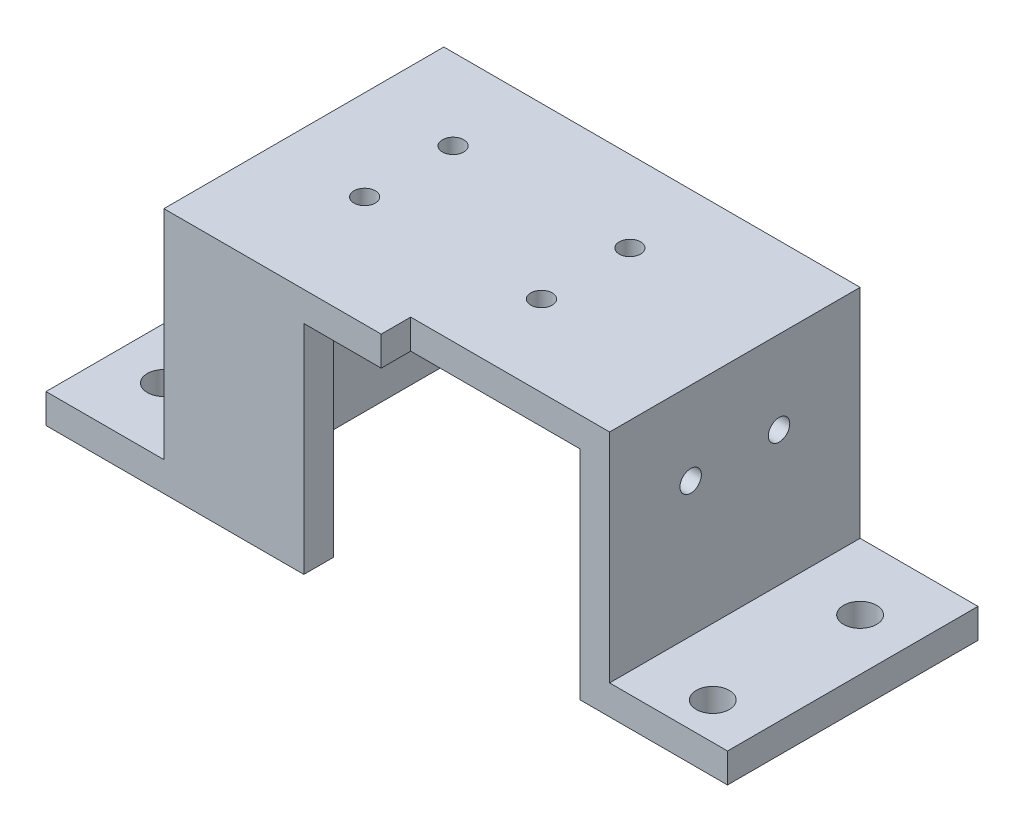
ISO-10303-21;
HEADER;
FILE_DESCRIPTION(('STEP AP214'),'2;1');
FILE_NAME('part.step','',(''),(''),'','','');
FILE_SCHEMA(('AUTOMOTIVE_DESIGN { 1 0 10303 214 1 1 1 1 }'));
ENDSEC;
DATA;
#1=APPLICATION_CONTEXT('core data for automotive mechanical design processes');
#2=APPLICATION_PROTOCOL_DEFINITION('international standard','automotive_design',2000,#1);
#3=PRODUCT_CONTEXT('',#1,'mechanical');
#4=PRODUCT('Part','Part','',(#3));
#5=PRODUCT_RELATED_PRODUCT_CATEGORY('part','',(#4));
#6=PRODUCT_DEFINITION_FORMATION('','',#4);
#7=PRODUCT_DEFINITION_CONTEXT('part definition',#1,'design');
#8=PRODUCT_DEFINITION('design','',#6,#7);
#9=PRODUCT_DEFINITION_SHAPE('','',#8);
#10=(LENGTH_UNIT() NAMED_UNIT(*) SI_UNIT(.MILLI.,.METRE.));
#11=(NAMED_UNIT(*) PLANE_ANGLE_UNIT() SI_UNIT($,.RADIAN.));
#12=(NAMED_UNIT(*) SI_UNIT($,.STERADIAN.) SOLID_ANGLE_UNIT());
#13=UNCERTAINTY_MEASURE_WITH_UNIT(LENGTH_MEASURE(1.E-05),#10,'distance_accuracy_value','');
#14=(GEOMETRIC_REPRESENTATION_CONTEXT(3) GLOBAL_UNCERTAINTY_ASSIGNED_CONTEXT((#13)) GLOBAL_UNIT_ASSIGNED_CONTEXT((#10,
#11,#12)) REPRESENTATION_CONTEXT('',''));
#15=CARTESIAN_POINT('',(0.,0.,0.));
#16=DIRECTION('',(0.,0.,1.));
#17=DIRECTION('',(1.,0.,0.));
#18=AXIS2_PLACEMENT_3D('',#15,#16,#17);
#19=CARTESIAN_POINT('',(28.25,4.,-19.));
#20=DIRECTION('',(-1.,0.,0.));
#21=DIRECTION('',(0.,0.,1.));
#22=AXIS2_PLACEMENT_3D('',#19,#20,#21);
#23=PLANE('',#22);
#24=CARTESIAN_POINT('',(28.25,-7.25,-8.));
#25=DIRECTION('',(1.,0.,0.));
#26=DIRECTION('',(0.,0.,-1.));
#27=AXIS2_PLACEMENT_3D('',#24,#25,#26);
#28=CIRCLE('',#27,1.44999999999999);
#29=CARTESIAN_POINT('',(28.25,-7.25,-9.44999999999999));
#30=VERTEX_POINT('',#29);
#31=EDGE_CURVE('E219',#30,#30,#28,.T.);
#32=ORIENTED_EDGE('',*,*,#31,.F.);
#33=EDGE_LOOP('',(#32));
#34=FACE_BOUND('',#33,.T.);
#35=CARTESIAN_POINT('',(28.25,-7.25,4.));
#36=DIRECTION('',(1.,0.,0.));
#37=DIRECTION('',(0.,0.,-1.));
#38=AXIS2_PLACEMENT_3D('',#35,#36,#37);
#39=CIRCLE('',#38,1.44999999999999);
#40=CARTESIAN_POINT('',(28.25,-7.25,2.55000000000001));
#41=VERTEX_POINT('',#40);
#42=EDGE_CURVE('E213',#41,#41,#39,.T.);
#43=ORIENTED_EDGE('',*,*,#42,.F.);
#44=EDGE_LOOP('',(#43));
#45=FACE_BOUND('',#44,.T.);
#46=DIRECTION('',(0.,1.,0.));
#47=VECTOR('',#46,1.);
#48=CARTESIAN_POINT('',(28.25,4.,15.));
#49=LINE('',#48,#47);
#50=CARTESIAN_POINT('',(28.25,-25.5,15.));
#51=VERTEX_POINT('',#50);
#52=CARTESIAN_POINT('',(28.25,4.,15.));
#53=VERTEX_POINT('',#52);
#54=EDGE_CURVE('E152',#51,#53,#49,.T.);
#55=ORIENTED_EDGE('',*,*,#54,.F.);
#56=DIRECTION('',(0.,0.,-1.));
#57=VECTOR('',#56,1.);
#58=CARTESIAN_POINT('',(28.25,-25.5,19.));
#59=LINE('',#58,#57);
#60=CARTESIAN_POINT('',(28.25,-25.5,-19.));
#61=VERTEX_POINT('',#60);
#62=EDGE_CURVE('E56',#51,#61,#59,.T.);
#63=ORIENTED_EDGE('',*,*,#62,.T.);
#64=DIRECTION('',(0.,-1.,0.));
#65=VECTOR('',#64,1.);
#66=CARTESIAN_POINT('',(28.25,4.,-19.));
#67=LINE('',#66,#65);
#68=CARTESIAN_POINT('',(28.25,4.,-19.));
#69=VERTEX_POINT('',#68);
#70=EDGE_CURVE('E42',#69,#61,#67,.T.);
#71=ORIENTED_EDGE('',*,*,#70,.F.);
#72=DIRECTION('',(0.,0.,-1.));
#73=VECTOR('',#72,1.);
#74=CARTESIAN_POINT('',(28.25,4.,-19.));
#75=LINE('',#74,#73);
#76=EDGE_CURVE('E317',#53,#69,#75,.T.);
#77=ORIENTED_EDGE('',*,*,#76,.F.);
#78=EDGE_LOOP('',(#55,#63,#71,#77));
#79=FACE_BOUND('',#78,.T.);
#80=ADVANCED_FACE('F35',(#34,#45,#79),#23,.F.);
#81=CARTESIAN_POINT('',(24.25,-29.5,19.));
#82=DIRECTION('',(1.,0.,0.));
#83=DIRECTION('',(0.,0.,-1.));
#84=AXIS2_PLACEMENT_3D('',#81,#82,#83);
#85=PLANE('',#84);
#86=CARTESIAN_POINT('',(24.25,-7.25,-8.));
#87=DIRECTION('',(1.,0.,0.));
#88=DIRECTION('',(0.,0.,-1.));
#89=AXIS2_PLACEMENT_3D('',#86,#87,#88);
#90=CIRCLE('',#89,1.44999999999999);
#91=CARTESIAN_POINT('',(24.25,-7.25,-9.44999999999999));
#92=VERTEX_POINT('',#91);
#93=EDGE_CURVE('E222',#92,#92,#90,.T.);
#94=ORIENTED_EDGE('',*,*,#93,.T.);
#95=EDGE_LOOP('',(#94));
#96=FACE_BOUND('',#95,.T.);
#97=CARTESIAN_POINT('',(24.25,-7.25,4.));
#98=DIRECTION('',(1.,0.,0.));
#99=DIRECTION('',(0.,0.,-1.));
#100=AXIS2_PLACEMENT_3D('',#97,#98,#99);
#101=CIRCLE('',#100,1.44999999999999);
#102=CARTESIAN_POINT('',(24.25,-7.25,2.55000000000001));
#103=VERTEX_POINT('',#102);
#104=EDGE_CURVE('E216',#103,#103,#101,.T.);
#105=ORIENTED_EDGE('',*,*,#104,.T.);
#106=EDGE_LOOP('',(#105));
#107=FACE_BOUND('',#106,.T.);
#108=DIRECTION('',(0.,-1.,0.));
#109=VECTOR('',#108,1.);
#110=CARTESIAN_POINT('',(24.25,-29.5,15.));
#111=LINE('',#110,#109);
#112=CARTESIAN_POINT('',(24.25,0.,15.));
#113=VERTEX_POINT('',#112);
#114=CARTESIAN_POINT('',(24.25,-29.5,15.));
#115=VERTEX_POINT('',#114);
#116=EDGE_CURVE('E171',#113,#115,#111,.T.);
#117=ORIENTED_EDGE('',*,*,#116,.F.);
#118=DIRECTION('',(0.,0.,-1.));
#119=VECTOR('',#118,1.);
#120=CARTESIAN_POINT('',(24.25,0.,19.));
#121=LINE('',#120,#119);
#122=CARTESIAN_POINT('',(24.25,0.,-19.));
#123=VERTEX_POINT('',#122);
#124=EDGE_CURVE('E307',#113,#123,#121,.T.);
#125=ORIENTED_EDGE('',*,*,#124,.T.);
#126=DIRECTION('',(0.,1.,0.));
#127=VECTOR('',#126,1.);
#128=CARTESIAN_POINT('',(24.25,-29.5,-19.));
#129=LINE('',#128,#127);
#130=CARTESIAN_POINT('',(24.25,-29.5,-19.));
#131=VERTEX_POINT('',#130);
#132=EDGE_CURVE('E312',#131,#123,#129,.T.);
#133=ORIENTED_EDGE('',*,*,#132,.F.);
#134=DIRECTION('',(0.,0.,-1.));
#135=VECTOR('',#134,1.);
#136=CARTESIAN_POINT('',(24.25,-29.5,19.));
#137=LINE('',#136,#135);
#138=EDGE_CURVE('E308',#115,#131,#137,.T.);
#139=ORIENTED_EDGE('',*,*,#138,.F.);
#140=EDGE_LOOP('',(#117,#125,#133,#139));
#141=FACE_BOUND('',#140,.T.);
#142=ADVANCED_FACE('F389',(#96,#107,#141),#85,.F.);
#143=CARTESIAN_POINT('',(0.,-29.5,0.));
#144=DIRECTION('',(0.,1.,0.));
#145=DIRECTION('',(0.,0.,1.));
#146=AXIS2_PLACEMENT_3D('',#143,#144,#145);
#147=PLANE('',#146);
#148=CARTESIAN_POINT('',(37.25,-29.5,10.));
#149=DIRECTION('',(0.,1.,0.));
#150=DIRECTION('',(0.,0.,1.));
#151=AXIS2_PLACEMENT_3D('',#148,#149,#150);
#152=CIRCLE('',#151,2.25);
#153=CARTESIAN_POINT('',(37.25,-29.5,12.25));
#154=VERTEX_POINT('',#153);
#155=EDGE_CURVE('E190',#154,#154,#152,.T.);
#156=ORIENTED_EDGE('',*,*,#155,.T.);
#157=EDGE_LOOP('',(#156));
#158=FACE_BOUND('',#157,.T.);
#159=CARTESIAN_POINT('',(37.25,-29.5,-10.));
#160=DIRECTION('',(0.,1.,0.));
#161=DIRECTION('',(0.,0.,1.));
#162=AXIS2_PLACEMENT_3D('',#159,#160,#161);
#163=CIRCLE('',#162,2.25);
#164=CARTESIAN_POINT('',(37.25,-29.5,-7.75));
#165=VERTEX_POINT('',#164);
#166=EDGE_CURVE('E184',#165,#165,#163,.T.);
#167=ORIENTED_EDGE('',*,*,#166,.T.);
#168=EDGE_LOOP('',(#167));
#169=FACE_BOUND('',#168,.T.);
#170=DIRECTION('',(1.,0.,0.));
#171=VECTOR('',#170,1.);
#172=CARTESIAN_POINT('',(44.25,-29.5,15.));
#173=LINE('',#172,#171);
#174=CARTESIAN_POINT('',(44.25,-29.5,15.));
#175=VERTEX_POINT('',#174);
#176=EDGE_CURVE('E163',#115,#175,#173,.T.);
#177=ORIENTED_EDGE('',*,*,#176,.F.);
#178=ORIENTED_EDGE('',*,*,#138,.T.);
#179=DIRECTION('',(1.,0.,0.));
#180=VECTOR('',#179,1.);
#181=CARTESIAN_POINT('',(28.25,-29.5,-19.));
#182=LINE('',#181,#180);
#183=CARTESIAN_POINT('',(44.25,-29.5,-19.));
#184=VERTEX_POINT('',#183);
#185=EDGE_CURVE('E310',#131,#184,#182,.T.);
#186=ORIENTED_EDGE('',*,*,#185,.T.);
#187=DIRECTION('',(0.,0.,1.));
#188=VECTOR('',#187,1.);
#189=CARTESIAN_POINT('',(44.25,-29.5,19.));
#190=LINE('',#189,#188);
#191=EDGE_CURVE('E255',#184,#175,#190,.T.);
#192=ORIENTED_EDGE('',*,*,#191,.T.);
#193=EDGE_LOOP('',(#177,#178,#186,#192));
#194=FACE_BOUND('',#193,.T.);
#195=ADVANCED_FACE('F393',(#158,#169,#194),#147,.F.);
#196=CARTESIAN_POINT('',(44.25,-25.5,19.));
#197=DIRECTION('',(1.,0.,0.));
#198=DIRECTION('',(0.,0.,-1.));
#199=AXIS2_PLACEMENT_3D('',#196,#197,#198);
#200=PLANE('',#199);
#201=DIRECTION('',(0.,0.,1.));
#202=VECTOR('',#201,1.);
#203=CARTESIAN_POINT('',(44.25,-25.5,19.));
#204=LINE('',#203,#202);
#205=CARTESIAN_POINT('',(44.25,-25.5,-19.));
#206=VERTEX_POINT('',#205);
#207=CARTESIAN_POINT('',(44.25,-25.5,15.));
#208=VERTEX_POINT('',#207);
#209=EDGE_CURVE('E266',#206,#208,#204,.T.);
#210=ORIENTED_EDGE('',*,*,#209,.T.);
#211=DIRECTION('',(0.,1.,0.));
#212=VECTOR('',#211,1.);
#213=CARTESIAN_POINT('',(44.25,-29.5,15.));
#214=LINE('',#213,#212);
#215=EDGE_CURVE('E48',#175,#208,#214,.T.);
#216=ORIENTED_EDGE('',*,*,#215,.F.);
#217=ORIENTED_EDGE('',*,*,#191,.F.);
#218=DIRECTION('',(0.,-1.,0.));
#219=VECTOR('',#218,1.);
#220=CARTESIAN_POINT('',(44.25,-25.5,-19.));
#221=LINE('',#220,#219);
#222=EDGE_CURVE('E269',#206,#184,#221,.T.);
#223=ORIENTED_EDGE('',*,*,#222,.F.);
#224=EDGE_LOOP('',(#210,#216,#217,#223));
#225=FACE_BOUND('',#224,.T.);
#226=ADVANCED_FACE('F396',(#225),#200,.T.);
#227=CARTESIAN_POINT('',(0.,-25.5,0.));
#228=DIRECTION('',(0.,-1.,0.));
#229=DIRECTION('',(0.,0.,-1.));
#230=AXIS2_PLACEMENT_3D('',#227,#228,#229);
#231=PLANE('',#230);
#232=CARTESIAN_POINT('',(37.25,-25.5,10.));
#233=DIRECTION('',(0.,1.,0.));
#234=DIRECTION('',(0.,0.,1.));
#235=AXIS2_PLACEMENT_3D('',#232,#233,#234);
#236=CIRCLE('',#235,2.25);
#237=CARTESIAN_POINT('',(37.25,-25.5,12.25));
#238=VERTEX_POINT('',#237);
#239=EDGE_CURVE('E187',#238,#238,#236,.T.);
#240=ORIENTED_EDGE('',*,*,#239,.F.);
#241=EDGE_LOOP('',(#240));
#242=FACE_BOUND('',#241,.T.);
#243=CARTESIAN_POINT('',(37.25,-25.5,-10.));
#244=DIRECTION('',(0.,1.,0.));
#245=DIRECTION('',(0.,0.,1.));
#246=AXIS2_PLACEMENT_3D('',#243,#244,#245);
#247=CIRCLE('',#246,2.25);
#248=CARTESIAN_POINT('',(37.25,-25.5,-7.75));
#249=VERTEX_POINT('',#248);
#250=EDGE_CURVE('E181',#249,#249,#247,.T.);
#251=ORIENTED_EDGE('',*,*,#250,.F.);
#252=EDGE_LOOP('',(#251));
#253=FACE_BOUND('',#252,.T.);
#254=DIRECTION('',(-1.,0.,0.));
#255=VECTOR('',#254,1.);
#256=CARTESIAN_POINT('',(0.,-25.5,15.));
#257=LINE('',#256,#255);
#258=EDGE_CURVE('E11',#208,#51,#257,.T.);
#259=ORIENTED_EDGE('',*,*,#258,.F.);
#260=ORIENTED_EDGE('',*,*,#209,.F.);
#261=DIRECTION('',(1.,0.,0.));
#262=VECTOR('',#261,1.);
#263=CARTESIAN_POINT('',(28.25,-25.5,-19.));
#264=LINE('',#263,#262);
#265=EDGE_CURVE('E263',#61,#206,#264,.T.);
#266=ORIENTED_EDGE('',*,*,#265,.F.);
#267=ORIENTED_EDGE('',*,*,#62,.F.);
#268=EDGE_LOOP('',(#259,#260,#266,#267));
#269=FACE_BOUND('',#268,.T.);
#270=ADVANCED_FACE('F399',(#242,#253,#269),#231,.F.);
#271=CARTESIAN_POINT('',(0.,0.,0.));
#272=DIRECTION('',(0.,1.,0.));
#273=DIRECTION('',(0.,0.,1.));
#274=AXIS2_PLACEMENT_3D('',#271,#272,#273);
#275=PLANE('',#274);
#276=CARTESIAN_POINT('',(8.00000000000001,0.,-8.));
#277=DIRECTION('',(0.,1.,0.));
#278=DIRECTION('',(0.,0.,1.));
#279=AXIS2_PLACEMENT_3D('',#276,#277,#278);
#280=CIRCLE('',#279,1.44999999999999);
#281=CARTESIAN_POINT('',(8.00000000000001,0.,-6.55000000000001));
#282=VERTEX_POINT('',#281);
#283=EDGE_CURVE('E226',#282,#282,#280,.T.);
#284=ORIENTED_EDGE('',*,*,#283,.T.);
#285=EDGE_LOOP('',(#284));
#286=FACE_BOUND('',#285,.T.);
#287=CARTESIAN_POINT('',(8.00000000000001,0.,4.));
#288=DIRECTION('',(0.,1.,0.));
#289=DIRECTION('',(0.,0.,1.));
#290=AXIS2_PLACEMENT_3D('',#287,#288,#289);
#291=CIRCLE('',#290,1.44999999999999);
#292=CARTESIAN_POINT('',(8.00000000000001,0.,5.44999999999999));
#293=VERTEX_POINT('',#292);
#294=EDGE_CURVE('E230',#293,#293,#291,.T.);
#295=ORIENTED_EDGE('',*,*,#294,.T.);
#296=EDGE_LOOP('',(#295));
#297=FACE_BOUND('',#296,.T.);
#298=CARTESIAN_POINT('',(-16.,0.,4.));
#299=DIRECTION('',(0.,1.,0.));
#300=DIRECTION('',(0.,0.,1.));
#301=AXIS2_PLACEMENT_3D('',#298,#299,#300);
#302=CIRCLE('',#301,1.44999999999999);
#303=CARTESIAN_POINT('',(-16.,0.,5.44999999999999));
#304=VERTEX_POINT('',#303);
#305=EDGE_CURVE('E236',#304,#304,#302,.T.);
#306=ORIENTED_EDGE('',*,*,#305,.T.);
#307=EDGE_LOOP('',(#306));
#308=FACE_BOUND('',#307,.T.);
#309=CARTESIAN_POINT('',(-16.,0.,-7.99999999999999));
#310=DIRECTION('',(0.,1.,0.));
#311=DIRECTION('',(0.,0.,1.));
#312=AXIS2_PLACEMENT_3D('',#309,#310,#311);
#313=CIRCLE('',#312,1.44999999999999);
#314=CARTESIAN_POINT('',(-16.,0.,-6.55000000000001));
#315=VERTEX_POINT('',#314);
#316=EDGE_CURVE('E242',#315,#315,#313,.T.);
#317=ORIENTED_EDGE('',*,*,#316,.T.);
#318=EDGE_LOOP('',(#317));
#319=FACE_BOUND('',#318,.T.);
#320=DIRECTION('',(1.,0.,0.));
#321=VECTOR('',#320,1.);
#322=CARTESIAN_POINT('',(0.,0.,15.));
#323=LINE('',#322,#321);
#324=CARTESIAN_POINT('',(1.25,0.,15.));
#325=VERTEX_POINT('',#324);
#326=EDGE_CURVE('E178',#325,#113,#323,.T.);
#327=ORIENTED_EDGE('',*,*,#326,.F.);
#328=DIRECTION('',(0.,0.,1.));
#329=VECTOR('',#328,1.);
#330=CARTESIAN_POINT('',(1.25,0.,0.));
#331=LINE('',#330,#329);
#332=CARTESIAN_POINT('',(1.25,0.,19.));
#333=VERTEX_POINT('',#332);
#334=EDGE_CURVE('E162',#325,#333,#331,.T.);
#335=ORIENTED_EDGE('',*,*,#334,.T.);
#336=DIRECTION('',(1.,0.,0.));
#337=VECTOR('',#336,1.);
#338=CARTESIAN_POINT('',(-28.25,0.,19.));
#339=LINE('',#338,#337);
#340=CARTESIAN_POINT('',(-9.24999999999999,0.,19.));
#341=VERTEX_POINT('',#340);
#342=EDGE_CURVE('E320',#341,#333,#339,.T.);
#343=ORIENTED_EDGE('',*,*,#342,.F.);
#344=DIRECTION('',(0.,0.,1.));
#345=VECTOR('',#344,1.);
#346=CARTESIAN_POINT('',(-9.24999999999999,0.,19.));
#347=LINE('',#346,#345);
#348=CARTESIAN_POINT('',(-9.24999999999999,0.,15.));
#349=VERTEX_POINT('',#348);
#350=EDGE_CURVE('E243',#349,#341,#347,.T.);
#351=ORIENTED_EDGE('',*,*,#350,.F.);
#352=DIRECTION('',(1.,0.,0.));
#353=VECTOR('',#352,1.);
#354=CARTESIAN_POINT('',(-24.25,0.,15.));
#355=LINE('',#354,#353);
#356=CARTESIAN_POINT('',(-24.25,0.,15.));
#357=VERTEX_POINT('',#356);
#358=EDGE_CURVE('E248',#357,#349,#355,.T.);
#359=ORIENTED_EDGE('',*,*,#358,.F.);
#360=DIRECTION('',(0.,0.,1.));
#361=VECTOR('',#360,1.);
#362=CARTESIAN_POINT('',(-24.25,0.,19.));
#363=LINE('',#362,#361);
#364=CARTESIAN_POINT('',(-24.25,0.,-19.));
#365=VERTEX_POINT('',#364);
#366=EDGE_CURVE('E293',#365,#357,#363,.T.);
#367=ORIENTED_EDGE('',*,*,#366,.F.);
#368=DIRECTION('',(-1.,0.,0.));
#369=VECTOR('',#368,1.);
#370=CARTESIAN_POINT('',(-28.25,0.,-19.));
#371=LINE('',#370,#369);
#372=EDGE_CURVE('E316',#123,#365,#371,.T.);
#373=ORIENTED_EDGE('',*,*,#372,.F.);
#374=ORIENTED_EDGE('',*,*,#124,.F.);
#375=EDGE_LOOP('',(#327,#335,#343,#351,#359,#367,#373,#374));
#376=FACE_BOUND('',#375,.T.);
#377=ADVANCED_FACE('F378',(#286,#297,#308,#319,#376),#275,.F.);
#378=CARTESIAN_POINT('',(-24.25,-29.5,19.));
#379=DIRECTION('',(-1.,0.,0.));
#380=DIRECTION('',(0.,0.,1.));
#381=AXIS2_PLACEMENT_3D('',#378,#379,#380);
#382=PLANE('',#381);
#383=CARTESIAN_POINT('',(-24.25,-7.25,4.));
#384=DIRECTION('',(-1.,0.,0.));
#385=DIRECTION('',(0.,0.,1.));
#386=AXIS2_PLACEMENT_3D('',#383,#384,#385);
#387=CIRCLE('',#386,1.44999999999999);
#388=CARTESIAN_POINT('',(-24.25,-7.25,5.44999999999999));
#389=VERTEX_POINT('',#388);
#390=EDGE_CURVE('E206',#389,#389,#387,.T.);
#391=ORIENTED_EDGE('',*,*,#390,.T.);
#392=EDGE_LOOP('',(#391));
#393=FACE_BOUND('',#392,.T.);
#394=CARTESIAN_POINT('',(-24.25,-7.25,-8.));
#395=DIRECTION('',(-1.,0.,0.));
#396=DIRECTION('',(0.,0.,1.));
#397=AXIS2_PLACEMENT_3D('',#394,#395,#396);
#398=CIRCLE('',#397,1.44999999999999);
#399=CARTESIAN_POINT('',(-24.25,-7.25,-6.55000000000001));
#400=VERTEX_POINT('',#399);
#401=EDGE_CURVE('E210',#400,#400,#398,.T.);
#402=ORIENTED_EDGE('',*,*,#401,.T.);
#403=EDGE_LOOP('',(#402));
#404=FACE_BOUND('',#403,.T.);
#405=DIRECTION('',(0.,1.,0.));
#406=VECTOR('',#405,1.);
#407=CARTESIAN_POINT('',(-24.25,-45.02417469626,15.));
#408=LINE('',#407,#406);
#409=CARTESIAN_POINT('',(-24.25,-29.5,15.));
#410=VERTEX_POINT('',#409);
#411=EDGE_CURVE('E251',#410,#357,#408,.T.);
#412=ORIENTED_EDGE('',*,*,#411,.F.);
#413=DIRECTION('',(0.,0.,1.));
#414=VECTOR('',#413,1.);
#415=CARTESIAN_POINT('',(-24.25,-29.5,19.));
#416=LINE('',#415,#414);
#417=CARTESIAN_POINT('',(-24.25,-29.5,-19.));
#418=VERTEX_POINT('',#417);
#419=EDGE_CURVE('E298',#418,#410,#416,.T.);
#420=ORIENTED_EDGE('',*,*,#419,.F.);
#421=DIRECTION('',(0.,1.,0.));
#422=VECTOR('',#421,1.);
#423=CARTESIAN_POINT('',(-24.25,-29.5,-19.));
#424=LINE('',#423,#422);
#425=EDGE_CURVE('E303',#418,#365,#424,.T.);
#426=ORIENTED_EDGE('',*,*,#425,.T.);
#427=ORIENTED_EDGE('',*,*,#366,.T.);
#428=EDGE_LOOP('',(#412,#420,#426,#427));
#429=FACE_BOUND('',#428,.T.);
#430=ADVANCED_FACE('F370',(#393,#404,#429),#382,.F.);
#431=CARTESIAN_POINT('',(-28.25,4.,-19.));
#432=DIRECTION('',(0.,0.,1.));
#433=DIRECTION('',(1.,0.,0.));
#434=AXIS2_PLACEMENT_3D('',#431,#432,#433);
#435=PLANE('',#434);
#436=ORIENTED_EDGE('',*,*,#70,.T.);
#437=ORIENTED_EDGE('',*,*,#265,.T.);
#438=ORIENTED_EDGE('',*,*,#222,.T.);
#439=ORIENTED_EDGE('',*,*,#185,.F.);
#440=ORIENTED_EDGE('',*,*,#132,.T.);
#441=ORIENTED_EDGE('',*,*,#372,.T.);
#442=ORIENTED_EDGE('',*,*,#425,.F.);
#443=DIRECTION('',(1.,0.,0.));
#444=VECTOR('',#443,1.);
#445=CARTESIAN_POINT('',(-28.25,-29.5,-19.));
#446=LINE('',#445,#444);
#447=CARTESIAN_POINT('',(-44.25,-29.5,-19.));
#448=VERTEX_POINT('',#447);
#449=EDGE_CURVE('E296',#448,#418,#446,.T.);
#450=ORIENTED_EDGE('',*,*,#449,.F.);
#451=DIRECTION('',(0.,-1.,0.));
#452=VECTOR('',#451,1.);
#453=CARTESIAN_POINT('',(-44.25,-25.5,-19.));
#454=LINE('',#453,#452);
#455=CARTESIAN_POINT('',(-44.25,-25.5,-19.));
#456=VERTEX_POINT('',#455);
#457=EDGE_CURVE('E290',#456,#448,#454,.T.);
#458=ORIENTED_EDGE('',*,*,#457,.F.);
#459=DIRECTION('',(1.,0.,0.));
#460=VECTOR('',#459,1.);
#461=CARTESIAN_POINT('',(-28.25,-25.5,-19.));
#462=LINE('',#461,#460);
#463=CARTESIAN_POINT('',(-28.25,-25.5,-19.));
#464=VERTEX_POINT('',#463);
#465=EDGE_CURVE('E284',#456,#464,#462,.T.);
#466=ORIENTED_EDGE('',*,*,#465,.T.);
#467=DIRECTION('',(0.,-1.,0.));
#468=VECTOR('',#467,1.);
#469=CARTESIAN_POINT('',(-28.25,4.,-19.));
#470=LINE('',#469,#468);
#471=CARTESIAN_POINT('',(-28.25,4.,-19.));
#472=VERTEX_POINT('',#471);
#473=EDGE_CURVE('E332',#472,#464,#470,.T.);
#474=ORIENTED_EDGE('',*,*,#473,.F.);
#475=DIRECTION('',(-1.,0.,0.));
#476=VECTOR('',#475,1.);
#477=CARTESIAN_POINT('',(-28.25,4.,-19.));
#478=LINE('',#477,#476);
#479=EDGE_CURVE('E319',#69,#472,#478,.T.);
#480=ORIENTED_EDGE('',*,*,#479,.F.);
#481=EDGE_LOOP('',(#436,#437,#438,#439,#440,#441,#442,#450,#458,#466,#474,#480));
#482=FACE_BOUND('',#481,.T.);
#483=ADVANCED_FACE('F364',(#482),#435,.F.);
#484=CARTESIAN_POINT('',(-28.25,4.,-19.));
#485=DIRECTION('',(1.,0.,0.));
#486=DIRECTION('',(0.,0.,-1.));
#487=AXIS2_PLACEMENT_3D('',#484,#485,#486);
#488=PLANE('',#487);
#489=CARTESIAN_POINT('',(-28.25,-7.25,4.));
#490=DIRECTION('',(-1.,0.,0.));
#491=DIRECTION('',(0.,0.,1.));
#492=AXIS2_PLACEMENT_3D('',#489,#490,#491);
#493=CIRCLE('',#492,1.44999999999999);
#494=CARTESIAN_POINT('',(-28.25,-7.25,5.44999999999999));
#495=VERTEX_POINT('',#494);
#496=EDGE_CURVE('E203',#495,#495,#493,.T.);
#497=ORIENTED_EDGE('',*,*,#496,.F.);
#498=EDGE_LOOP('',(#497));
#499=FACE_BOUND('',#498,.T.);
#500=CARTESIAN_POINT('',(-28.25,-7.25,-8.));
#501=DIRECTION('',(-1.,0.,0.));
#502=DIRECTION('',(0.,0.,1.));
#503=AXIS2_PLACEMENT_3D('',#500,#501,#502);
#504=CIRCLE('',#503,1.44999999999999);
#505=CARTESIAN_POINT('',(-28.25,-7.25,-6.55000000000001));
#506=VERTEX_POINT('',#505);
#507=EDGE_CURVE('E207',#506,#506,#504,.T.);
#508=ORIENTED_EDGE('',*,*,#507,.F.);
#509=EDGE_LOOP('',(#508));
#510=FACE_BOUND('',#509,.T.);
#511=ORIENTED_EDGE('',*,*,#473,.T.);
#512=DIRECTION('',(0.,0.,1.));
#513=VECTOR('',#512,1.);
#514=CARTESIAN_POINT('',(-28.25,-25.5,19.));
#515=LINE('',#514,#513);
#516=CARTESIAN_POINT('',(-28.25,-25.5,19.));
#517=VERTEX_POINT('',#516);
#518=EDGE_CURVE('E275',#464,#517,#515,.T.);
#519=ORIENTED_EDGE('',*,*,#518,.T.);
#520=DIRECTION('',(0.,-1.,0.));
#521=VECTOR('',#520,1.);
#522=CARTESIAN_POINT('',(-28.25,4.,19.));
#523=LINE('',#522,#521);
#524=CARTESIAN_POINT('',(-28.25,4.,19.));
#525=VERTEX_POINT('',#524);
#526=EDGE_CURVE('E325',#525,#517,#523,.T.);
#527=ORIENTED_EDGE('',*,*,#526,.F.);
#528=DIRECTION('',(0.,0.,1.));
#529=VECTOR('',#528,1.);
#530=CARTESIAN_POINT('',(-28.25,4.,-19.));
#531=LINE('',#530,#529);
#532=EDGE_CURVE('E322',#472,#525,#531,.T.);
#533=ORIENTED_EDGE('',*,*,#532,.F.);
#534=EDGE_LOOP('',(#511,#519,#527,#533));
#535=FACE_BOUND('',#534,.T.);
#536=ADVANCED_FACE('F404',(#499,#510,#535),#488,.F.);
#537=CARTESIAN_POINT('',(-28.25,4.,19.));
#538=DIRECTION('',(0.,0.,-1.));
#539=DIRECTION('',(-1.,0.,0.));
#540=AXIS2_PLACEMENT_3D('',#537,#538,#539);
#541=PLANE('',#540);
#542=ORIENTED_EDGE('',*,*,#342,.T.);
#543=DIRECTION('',(0.,-1.,0.));
#544=VECTOR('',#543,1.);
#545=CARTESIAN_POINT('',(1.25,-29.5,19.));
#546=LINE('',#545,#544);
#547=CARTESIAN_POINT('',(1.25,4.,19.));
#548=VERTEX_POINT('',#547);
#549=EDGE_CURVE('E175',#548,#333,#546,.T.);
#550=ORIENTED_EDGE('',*,*,#549,.F.);
#551=DIRECTION('',(1.,0.,0.));
#552=VECTOR('',#551,1.);
#553=CARTESIAN_POINT('',(-28.25,4.,19.));
#554=LINE('',#553,#552);
#555=EDGE_CURVE('E169',#525,#548,#554,.T.);
#556=ORIENTED_EDGE('',*,*,#555,.F.);
#557=ORIENTED_EDGE('',*,*,#526,.T.);
#558=DIRECTION('',(-1.,0.,0.));
#559=VECTOR('',#558,1.);
#560=CARTESIAN_POINT('',(-28.25,-25.5,19.));
#561=LINE('',#560,#559);
#562=CARTESIAN_POINT('',(-44.25,-25.5,19.));
#563=VERTEX_POINT('',#562);
#564=EDGE_CURVE('E278',#517,#563,#561,.T.);
#565=ORIENTED_EDGE('',*,*,#564,.T.);
#566=DIRECTION('',(0.,-1.,0.));
#567=VECTOR('',#566,1.);
#568=CARTESIAN_POINT('',(-44.25,-25.5,19.));
#569=LINE('',#568,#567);
#570=CARTESIAN_POINT('',(-44.25,-29.5,19.));
#571=VERTEX_POINT('',#570);
#572=EDGE_CURVE('E287',#563,#571,#569,.T.);
#573=ORIENTED_EDGE('',*,*,#572,.T.);
#574=DIRECTION('',(-1.,0.,0.));
#575=VECTOR('',#574,1.);
#576=CARTESIAN_POINT('',(-28.25,-29.5,19.));
#577=LINE('',#576,#575);
#578=CARTESIAN_POINT('',(-9.24999999999999,-29.5,19.));
#579=VERTEX_POINT('',#578);
#580=EDGE_CURVE('E301',#579,#571,#577,.T.);
#581=ORIENTED_EDGE('',*,*,#580,.F.);
#582=DIRECTION('',(0.,1.,0.));
#583=VECTOR('',#582,1.);
#584=CARTESIAN_POINT('',(-9.24999999999999,-45.02417469626,19.));
#585=LINE('',#584,#583);
#586=EDGE_CURVE('E246',#579,#341,#585,.T.);
#587=ORIENTED_EDGE('',*,*,#586,.T.);
#588=EDGE_LOOP('',(#542,#550,#556,#557,#565,#573,#581,#587));
#589=FACE_BOUND('',#588,.T.);
#590=ADVANCED_FACE('F359',(#589),#541,.F.);
#591=CARTESIAN_POINT('',(0.,4.,0.));
#592=DIRECTION('',(0.,1.,0.));
#593=DIRECTION('',(0.,0.,1.));
#594=AXIS2_PLACEMENT_3D('',#591,#592,#593);
#595=PLANE('',#594);
#596=DIRECTION('',(0.,0.,1.));
#597=VECTOR('',#596,1.);
#598=CARTESIAN_POINT('',(1.25,4.,15.));
#599=LINE('',#598,#597);
#600=CARTESIAN_POINT('',(1.25,4.,15.));
#601=VERTEX_POINT('',#600);
#602=EDGE_CURVE('E159',#601,#548,#599,.T.);
#603=ORIENTED_EDGE('',*,*,#602,.F.);
#604=DIRECTION('',(-1.,0.,0.));
#605=VECTOR('',#604,1.);
#606=CARTESIAN_POINT('',(44.25,4.,15.));
#607=LINE('',#606,#605);
#608=EDGE_CURVE('E147',#53,#601,#607,.T.);
#609=ORIENTED_EDGE('',*,*,#608,.F.);
#610=ORIENTED_EDGE('',*,*,#76,.T.);
#611=ORIENTED_EDGE('',*,*,#479,.T.);
#612=ORIENTED_EDGE('',*,*,#532,.T.);
#613=ORIENTED_EDGE('',*,*,#555,.T.);
#614=EDGE_LOOP('',(#603,#609,#610,#611,#612,#613));
#615=FACE_BOUND('',#614,.T.);
#616=CARTESIAN_POINT('',(8.00000000000001,4.,-8.));
#617=DIRECTION('',(0.,1.,0.));
#618=DIRECTION('',(0.,0.,1.));
#619=AXIS2_PLACEMENT_3D('',#616,#617,#618);
#620=CIRCLE('',#619,1.44999999999999);
#621=CARTESIAN_POINT('',(8.00000000000001,4.,-6.55000000000001));
#622=VERTEX_POINT('',#621);
#623=EDGE_CURVE('E223',#622,#622,#620,.T.);
#624=ORIENTED_EDGE('',*,*,#623,.F.);
#625=EDGE_LOOP('',(#624));
#626=FACE_BOUND('',#625,.T.);
#627=CARTESIAN_POINT('',(8.00000000000001,4.,4.));
#628=DIRECTION('',(0.,1.,0.));
#629=DIRECTION('',(0.,0.,1.));
#630=AXIS2_PLACEMENT_3D('',#627,#628,#629);
#631=CIRCLE('',#630,1.44999999999999);
#632=CARTESIAN_POINT('',(8.00000000000001,4.,5.44999999999999));
#633=VERTEX_POINT('',#632);
#634=EDGE_CURVE('E227',#633,#633,#631,.T.);
#635=ORIENTED_EDGE('',*,*,#634,.F.);
#636=EDGE_LOOP('',(#635));
#637=FACE_BOUND('',#636,.T.);
#638=CARTESIAN_POINT('',(-16.,4.,4.));
#639=DIRECTION('',(0.,1.,0.));
#640=DIRECTION('',(0.,0.,1.));
#641=AXIS2_PLACEMENT_3D('',#638,#639,#640);
#642=CIRCLE('',#641,1.44999999999999);
#643=CARTESIAN_POINT('',(-16.,4.,5.44999999999999));
#644=VERTEX_POINT('',#643);
#645=EDGE_CURVE('E233',#644,#644,#642,.T.);
#646=ORIENTED_EDGE('',*,*,#645,.F.);
#647=EDGE_LOOP('',(#646));
#648=FACE_BOUND('',#647,.T.);
#649=CARTESIAN_POINT('',(-16.,4.,-7.99999999999999));
#650=DIRECTION('',(0.,1.,0.));
#651=DIRECTION('',(0.,0.,1.));
#652=AXIS2_PLACEMENT_3D('',#649,#650,#651);
#653=CIRCLE('',#652,1.44999999999999);
#654=CARTESIAN_POINT('',(-16.,4.,-6.55000000000001));
#655=VERTEX_POINT('',#654);
#656=EDGE_CURVE('E239',#655,#655,#653,.T.);
#657=ORIENTED_EDGE('',*,*,#656,.F.);
#658=EDGE_LOOP('',(#657));
#659=FACE_BOUND('',#658,.T.);
#660=ADVANCED_FACE('F166',(#615,#626,#637,#648,#659),#595,.T.);
#661=CARTESIAN_POINT('',(0.,-29.5,0.));
#662=DIRECTION('',(0.,-1.,0.));
#663=DIRECTION('',(0.,0.,-1.));
#664=AXIS2_PLACEMENT_3D('',#661,#662,#663);
#665=PLANE('',#664);
#666=CARTESIAN_POINT('',(-37.25,-29.5,10.));
#667=DIRECTION('',(0.,-1.,0.));
#668=DIRECTION('',(0.,0.,-1.));
#669=AXIS2_PLACEMENT_3D('',#666,#667,#668);
#670=CIRCLE('',#669,2.25);
#671=CARTESIAN_POINT('',(-37.25,-29.5,7.75));
#672=VERTEX_POINT('',#671);
#673=EDGE_CURVE('E196',#672,#672,#670,.T.);
#674=ORIENTED_EDGE('',*,*,#673,.F.);
#675=EDGE_LOOP('',(#674));
#676=FACE_BOUND('',#675,.T.);
#677=CARTESIAN_POINT('',(-37.25,-29.5,-10.));
#678=DIRECTION('',(0.,-1.,0.));
#679=DIRECTION('',(0.,0.,-1.));
#680=AXIS2_PLACEMENT_3D('',#677,#678,#679);
#681=CIRCLE('',#680,2.25);
#682=CARTESIAN_POINT('',(-37.25,-29.5,-12.25));
#683=VERTEX_POINT('',#682);
#684=EDGE_CURVE('E202',#683,#683,#681,.T.);
#685=ORIENTED_EDGE('',*,*,#684,.F.);
#686=EDGE_LOOP('',(#685));
#687=FACE_BOUND('',#686,.T.);
#688=ORIENTED_EDGE('',*,*,#580,.T.);
#689=DIRECTION('',(0.,0.,-1.));
#690=VECTOR('',#689,1.);
#691=CARTESIAN_POINT('',(-44.25,-29.5,19.));
#692=LINE('',#691,#690);
#693=EDGE_CURVE('E274',#571,#448,#692,.T.);
#694=ORIENTED_EDGE('',*,*,#693,.T.);
#695=ORIENTED_EDGE('',*,*,#449,.T.);
#696=ORIENTED_EDGE('',*,*,#419,.T.);
#697=DIRECTION('',(1.,0.,0.));
#698=VECTOR('',#697,1.);
#699=CARTESIAN_POINT('',(-24.25,-29.5,15.));
#700=LINE('',#699,#698);
#701=CARTESIAN_POINT('',(-9.24999999999999,-29.5,15.));
#702=VERTEX_POINT('',#701);
#703=EDGE_CURVE('E256',#410,#702,#700,.T.);
#704=ORIENTED_EDGE('',*,*,#703,.T.);
#705=DIRECTION('',(0.,0.,1.));
#706=VECTOR('',#705,1.);
#707=CARTESIAN_POINT('',(-9.24999999999999,-29.5,19.));
#708=LINE('',#707,#706);
#709=EDGE_CURVE('E252',#702,#579,#708,.T.);
#710=ORIENTED_EDGE('',*,*,#709,.T.);
#711=EDGE_LOOP('',(#688,#694,#695,#696,#704,#710));
#712=FACE_BOUND('',#711,.T.);
#713=ADVANCED_FACE('F350',(#676,#687,#712),#665,.T.);
#714=CARTESIAN_POINT('',(-44.25,-25.5,19.));
#715=DIRECTION('',(-1.,0.,0.));
#716=DIRECTION('',(0.,0.,1.));
#717=AXIS2_PLACEMENT_3D('',#714,#715,#716);
#718=PLANE('',#717);
#719=ORIENTED_EDGE('',*,*,#693,.F.);
#720=ORIENTED_EDGE('',*,*,#572,.F.);
#721=DIRECTION('',(0.,0.,-1.));
#722=VECTOR('',#721,1.);
#723=CARTESIAN_POINT('',(-44.25,-25.5,19.));
#724=LINE('',#723,#722);
#725=EDGE_CURVE('E281',#563,#456,#724,.T.);
#726=ORIENTED_EDGE('',*,*,#725,.T.);
#727=ORIENTED_EDGE('',*,*,#457,.T.);
#728=EDGE_LOOP('',(#719,#720,#726,#727));
#729=FACE_BOUND('',#728,.T.);
#730=ADVANCED_FACE('F353',(#729),#718,.T.);
#731=CARTESIAN_POINT('',(0.,-25.5,0.));
#732=DIRECTION('',(0.,1.,0.));
#733=DIRECTION('',(0.,0.,1.));
#734=AXIS2_PLACEMENT_3D('',#731,#732,#733);
#735=PLANE('',#734);
#736=CARTESIAN_POINT('',(-37.25,-25.5,10.));
#737=DIRECTION('',(0.,1.,0.));
#738=DIRECTION('',(0.,0.,1.));
#739=AXIS2_PLACEMENT_3D('',#736,#737,#738);
#740=CIRCLE('',#739,2.25);
#741=CARTESIAN_POINT('',(-37.25,-25.5,12.25));
#742=VERTEX_POINT('',#741);
#743=EDGE_CURVE('E193',#742,#742,#740,.T.);
#744=ORIENTED_EDGE('',*,*,#743,.F.);
#745=EDGE_LOOP('',(#744));
#746=FACE_BOUND('',#745,.T.);
#747=CARTESIAN_POINT('',(-37.25,-25.5,-10.));
#748=DIRECTION('',(0.,1.,0.));
#749=DIRECTION('',(0.,0.,1.));
#750=AXIS2_PLACEMENT_3D('',#747,#748,#749);
#751=CIRCLE('',#750,2.25);
#752=CARTESIAN_POINT('',(-37.25,-25.5,-7.75));
#753=VERTEX_POINT('',#752);
#754=EDGE_CURVE('E199',#753,#753,#751,.T.);
#755=ORIENTED_EDGE('',*,*,#754,.F.);
#756=EDGE_LOOP('',(#755));
#757=FACE_BOUND('',#756,.T.);
#758=ORIENTED_EDGE('',*,*,#518,.F.);
#759=ORIENTED_EDGE('',*,*,#465,.F.);
#760=ORIENTED_EDGE('',*,*,#725,.F.);
#761=ORIENTED_EDGE('',*,*,#564,.F.);
#762=EDGE_LOOP('',(#758,#759,#760,#761));
#763=FACE_BOUND('',#762,.T.);
#764=ADVANCED_FACE('F406',(#746,#757,#763),#735,.T.);
#765=CARTESIAN_POINT('',(-24.25,-45.02417469626,15.));
#766=DIRECTION('',(0.,0.,1.));
#767=DIRECTION('',(1.,0.,0.));
#768=AXIS2_PLACEMENT_3D('',#765,#766,#767);
#769=PLANE('',#768);
#770=ORIENTED_EDGE('',*,*,#703,.F.);
#771=ORIENTED_EDGE('',*,*,#411,.T.);
#772=ORIENTED_EDGE('',*,*,#358,.T.);
#773=DIRECTION('',(0.,1.,0.));
#774=VECTOR('',#773,1.);
#775=CARTESIAN_POINT('',(-9.24999999999999,-45.02417469626,15.));
#776=LINE('',#775,#774);
#777=EDGE_CURVE('E247',#702,#349,#776,.T.);
#778=ORIENTED_EDGE('',*,*,#777,.F.);
#779=EDGE_LOOP('',(#770,#771,#772,#778));
#780=FACE_BOUND('',#779,.T.);
#781=ADVANCED_FACE('F374',(#780),#769,.F.);
#782=CARTESIAN_POINT('',(-9.24999999999999,-45.02417469626,19.));
#783=DIRECTION('',(-1.,0.,0.));
#784=DIRECTION('',(0.,0.,1.));
#785=AXIS2_PLACEMENT_3D('',#782,#783,#784);
#786=PLANE('',#785);
#787=ORIENTED_EDGE('',*,*,#709,.F.);
#788=ORIENTED_EDGE('',*,*,#777,.T.);
#789=ORIENTED_EDGE('',*,*,#350,.T.);
#790=ORIENTED_EDGE('',*,*,#586,.F.);
#791=EDGE_LOOP('',(#787,#788,#789,#790));
#792=FACE_BOUND('',#791,.T.);
#793=ADVANCED_FACE('F382',(#792),#786,.F.);
#794=CARTESIAN_POINT('',(-16.,4.,-7.99999999999999));
#795=DIRECTION('',(0.,1.,0.));
#796=DIRECTION('',(0.,0.,1.));
#797=AXIS2_PLACEMENT_3D('',#794,#795,#796);
#798=CYLINDRICAL_SURFACE('',#797,1.44999999999999);
#799=ORIENTED_EDGE('',*,*,#656,.T.);
#800=EDGE_LOOP('',(#799));
#801=FACE_BOUND('',#800,.T.);
#802=ORIENTED_EDGE('',*,*,#316,.F.);
#803=EDGE_LOOP('',(#802));
#804=FACE_BOUND('',#803,.T.);
#805=ADVANCED_FACE('F460',(#801,#804),#798,.F.);
#806=CARTESIAN_POINT('',(-16.,4.,4.));
#807=DIRECTION('',(0.,1.,0.));
#808=DIRECTION('',(0.,0.,1.));
#809=AXIS2_PLACEMENT_3D('',#806,#807,#808);
#810=CYLINDRICAL_SURFACE('',#809,1.44999999999999);
#811=ORIENTED_EDGE('',*,*,#645,.T.);
#812=EDGE_LOOP('',(#811));
#813=FACE_BOUND('',#812,.T.);
#814=ORIENTED_EDGE('',*,*,#305,.F.);
#815=EDGE_LOOP('',(#814));
#816=FACE_BOUND('',#815,.T.);
#817=ADVANCED_FACE('F456',(#813,#816),#810,.F.);
#818=CARTESIAN_POINT('',(8.00000000000001,4.,4.));
#819=DIRECTION('',(0.,1.,0.));
#820=DIRECTION('',(0.,0.,1.));
#821=AXIS2_PLACEMENT_3D('',#818,#819,#820);
#822=CYLINDRICAL_SURFACE('',#821,1.44999999999999);
#823=ORIENTED_EDGE('',*,*,#634,.T.);
#824=EDGE_LOOP('',(#823));
#825=FACE_BOUND('',#824,.T.);
#826=ORIENTED_EDGE('',*,*,#294,.F.);
#827=EDGE_LOOP('',(#826));
#828=FACE_BOUND('',#827,.T.);
#829=ADVANCED_FACE('F452',(#825,#828),#822,.F.);
#830=CARTESIAN_POINT('',(8.00000000000001,4.,-8.));
#831=DIRECTION('',(0.,1.,0.));
#832=DIRECTION('',(0.,0.,1.));
#833=AXIS2_PLACEMENT_3D('',#830,#831,#832);
#834=CYLINDRICAL_SURFACE('',#833,1.44999999999999);
#835=ORIENTED_EDGE('',*,*,#623,.T.);
#836=EDGE_LOOP('',(#835));
#837=FACE_BOUND('',#836,.T.);
#838=ORIENTED_EDGE('',*,*,#283,.F.);
#839=EDGE_LOOP('',(#838));
#840=FACE_BOUND('',#839,.T.);
#841=ADVANCED_FACE('F445',(#837,#840),#834,.F.);
#842=CARTESIAN_POINT('',(28.25,-7.25,-8.));
#843=DIRECTION('',(1.,0.,0.));
#844=DIRECTION('',(0.,0.,-1.));
#845=AXIS2_PLACEMENT_3D('',#842,#843,#844);
#846=CYLINDRICAL_SURFACE('',#845,1.44999999999999);
#847=ORIENTED_EDGE('',*,*,#31,.T.);
#848=EDGE_LOOP('',(#847));
#849=FACE_BOUND('',#848,.T.);
#850=ORIENTED_EDGE('',*,*,#93,.F.);
#851=EDGE_LOOP('',(#850));
#852=FACE_BOUND('',#851,.T.);
#853=ADVANCED_FACE('F434',(#849,#852),#846,.F.);
#854=CARTESIAN_POINT('',(28.25,-7.25,4.));
#855=DIRECTION('',(1.,0.,0.));
#856=DIRECTION('',(0.,0.,-1.));
#857=AXIS2_PLACEMENT_3D('',#854,#855,#856);
#858=CYLINDRICAL_SURFACE('',#857,1.44999999999999);
#859=ORIENTED_EDGE('',*,*,#42,.T.);
#860=EDGE_LOOP('',(#859));
#861=FACE_BOUND('',#860,.T.);
#862=ORIENTED_EDGE('',*,*,#104,.F.);
#863=EDGE_LOOP('',(#862));
#864=FACE_BOUND('',#863,.T.);
#865=ADVANCED_FACE('F430',(#861,#864),#858,.F.);
#866=CARTESIAN_POINT('',(-28.25,-7.25,-8.));
#867=DIRECTION('',(-1.,0.,0.));
#868=DIRECTION('',(0.,0.,1.));
#869=AXIS2_PLACEMENT_3D('',#866,#867,#868);
#870=CYLINDRICAL_SURFACE('',#869,1.44999999999999);
#871=ORIENTED_EDGE('',*,*,#507,.T.);
#872=EDGE_LOOP('',(#871));
#873=FACE_BOUND('',#872,.T.);
#874=ORIENTED_EDGE('',*,*,#401,.F.);
#875=EDGE_LOOP('',(#874));
#876=FACE_BOUND('',#875,.T.);
#877=ADVANCED_FACE('F433',(#873,#876),#870,.F.);
#878=CARTESIAN_POINT('',(-28.25,-7.25,4.));
#879=DIRECTION('',(-1.,0.,0.));
#880=DIRECTION('',(0.,0.,1.));
#881=AXIS2_PLACEMENT_3D('',#878,#879,#880);
#882=CYLINDRICAL_SURFACE('',#881,1.44999999999999);
#883=ORIENTED_EDGE('',*,*,#496,.T.);
#884=EDGE_LOOP('',(#883));
#885=FACE_BOUND('',#884,.T.);
#886=ORIENTED_EDGE('',*,*,#390,.F.);
#887=EDGE_LOOP('',(#886));
#888=FACE_BOUND('',#887,.T.);
#889=ADVANCED_FACE('F442',(#885,#888),#882,.F.);
#890=CARTESIAN_POINT('',(-37.25,-25.5,-10.));
#891=DIRECTION('',(0.,1.,0.));
#892=DIRECTION('',(0.,0.,1.));
#893=AXIS2_PLACEMENT_3D('',#890,#891,#892);
#894=CYLINDRICAL_SURFACE('',#893,2.25);
#895=ORIENTED_EDGE('',*,*,#684,.T.);
#896=EDGE_LOOP('',(#895));
#897=FACE_BOUND('',#896,.T.);
#898=ORIENTED_EDGE('',*,*,#754,.T.);
#899=EDGE_LOOP('',(#898));
#900=FACE_BOUND('',#899,.T.);
#901=ADVANCED_FACE('F347',(#897,#900),#894,.F.);
#902=CARTESIAN_POINT('',(-37.25,-25.5,10.));
#903=DIRECTION('',(0.,1.,0.));
#904=DIRECTION('',(0.,0.,1.));
#905=AXIS2_PLACEMENT_3D('',#902,#903,#904);
#906=CYLINDRICAL_SURFACE('',#905,2.25);
#907=ORIENTED_EDGE('',*,*,#673,.T.);
#908=EDGE_LOOP('',(#907));
#909=FACE_BOUND('',#908,.T.);
#910=ORIENTED_EDGE('',*,*,#743,.T.);
#911=EDGE_LOOP('',(#910));
#912=FACE_BOUND('',#911,.T.);
#913=ADVANCED_FACE('F506',(#909,#912),#906,.F.);
#914=CARTESIAN_POINT('',(37.25,-25.5,10.));
#915=DIRECTION('',(0.,1.,0.));
#916=DIRECTION('',(0.,0.,1.));
#917=AXIS2_PLACEMENT_3D('',#914,#915,#916);
#918=CYLINDRICAL_SURFACE('',#917,2.25);
#919=ORIENTED_EDGE('',*,*,#239,.T.);
#920=EDGE_LOOP('',(#919));
#921=FACE_BOUND('',#920,.T.);
#922=ORIENTED_EDGE('',*,*,#155,.F.);
#923=EDGE_LOOP('',(#922));
#924=FACE_BOUND('',#923,.T.);
#925=ADVANCED_FACE('F511',(#921,#924),#918,.F.);
#926=CARTESIAN_POINT('',(37.25,-25.5,-10.));
#927=DIRECTION('',(0.,1.,0.));
#928=DIRECTION('',(0.,0.,1.));
#929=AXIS2_PLACEMENT_3D('',#926,#927,#928);
#930=CYLINDRICAL_SURFACE('',#929,2.25);
#931=ORIENTED_EDGE('',*,*,#250,.T.);
#932=EDGE_LOOP('',(#931));
#933=FACE_BOUND('',#932,.T.);
#934=ORIENTED_EDGE('',*,*,#166,.F.);
#935=EDGE_LOOP('',(#934));
#936=FACE_BOUND('',#935,.T.);
#937=ADVANCED_FACE('F515',(#933,#936),#930,.F.);
#938=CARTESIAN_POINT('',(1.25,-29.5,15.));
#939=DIRECTION('',(-1.,0.,0.));
#940=DIRECTION('',(0.,0.,1.));
#941=AXIS2_PLACEMENT_3D('',#938,#939,#940);
#942=PLANE('',#941);
#943=DIRECTION('',(0.,-1.,0.));
#944=VECTOR('',#943,1.);
#945=CARTESIAN_POINT('',(1.25,-29.5,15.));
#946=LINE('',#945,#944);
#947=EDGE_CURVE('E150',#601,#325,#946,.T.);
#948=ORIENTED_EDGE('',*,*,#947,.F.);
#949=ORIENTED_EDGE('',*,*,#602,.T.);
#950=ORIENTED_EDGE('',*,*,#549,.T.);
#951=ORIENTED_EDGE('',*,*,#334,.F.);
#952=EDGE_LOOP('',(#948,#949,#950,#951));
#953=FACE_BOUND('',#952,.T.);
#954=ADVANCED_FACE('F158',(#953),#942,.F.);
#955=CARTESIAN_POINT('',(0.,0.,15.));
#956=DIRECTION('',(0.,0.,1.));
#957=DIRECTION('',(1.,0.,0.));
#958=AXIS2_PLACEMENT_3D('',#955,#956,#957);
#959=PLANE('',#958);
#960=ORIENTED_EDGE('',*,*,#326,.T.);
#961=ORIENTED_EDGE('',*,*,#116,.T.);
#962=ORIENTED_EDGE('',*,*,#176,.T.);
#963=ORIENTED_EDGE('',*,*,#215,.T.);
#964=ORIENTED_EDGE('',*,*,#258,.T.);
#965=ORIENTED_EDGE('',*,*,#54,.T.);
#966=ORIENTED_EDGE('',*,*,#608,.T.);
#967=ORIENTED_EDGE('',*,*,#947,.T.);
#968=EDGE_LOOP('',(#960,#961,#962,#963,#964,#965,#966,#967));
#969=FACE_BOUND('',#968,.T.);
#970=ADVANCED_FACE('F149',(#969),#959,.T.);
#971=CLOSED_SHELL('',(#80,#142,#195,#226,#270,#377,#430,#483,#536,#590,#660,#713,#730,#764,#781,
#793,#805,#817,#829,#841,#853,#865,#877,#889,#901,#913,#925,#937,#954,#970));
#972=MANIFOLD_SOLID_BREP('B2',#971);
#973=ADVANCED_BREP_SHAPE_REPRESENTATION('',(#18,#972),#14);
#974=SHAPE_DEFINITION_REPRESENTATION(#9,#973);
ENDSEC;
END-ISO-10303-21;
